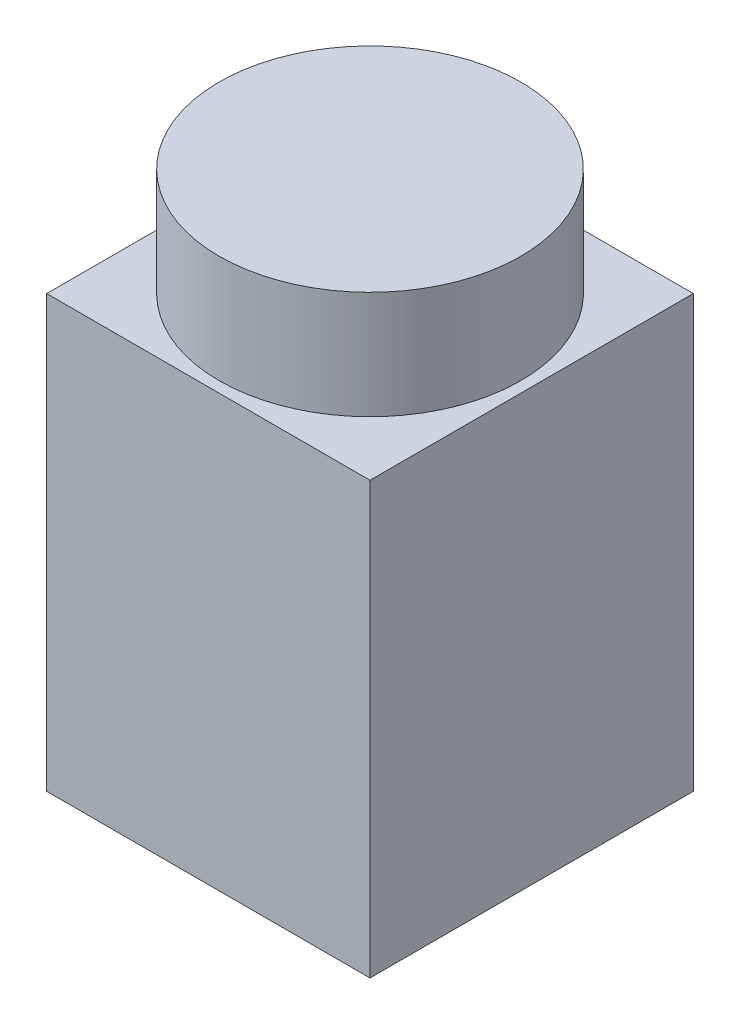
ISO-10303-21;
HEADER;
FILE_DESCRIPTION(('STEP AP214'),'2;1');
FILE_NAME('part.step','',(''),(''),'','','');
FILE_SCHEMA(('AUTOMOTIVE_DESIGN { 1 0 10303 214 1 1 1 1 }'));
ENDSEC;
DATA;
#1=APPLICATION_CONTEXT('core data for automotive mechanical design processes');
#2=APPLICATION_PROTOCOL_DEFINITION('international standard','automotive_design',2000,#1);
#3=PRODUCT_CONTEXT('',#1,'mechanical');
#4=PRODUCT('Part','Part','',(#3));
#5=PRODUCT_RELATED_PRODUCT_CATEGORY('part','',(#4));
#6=PRODUCT_DEFINITION_FORMATION('','',#4);
#7=PRODUCT_DEFINITION_CONTEXT('part definition',#1,'design');
#8=PRODUCT_DEFINITION('design','',#6,#7);
#9=PRODUCT_DEFINITION_SHAPE('','',#8);
#10=(LENGTH_UNIT() NAMED_UNIT(*) SI_UNIT(.MILLI.,.METRE.));
#11=(NAMED_UNIT(*) PLANE_ANGLE_UNIT() SI_UNIT($,.RADIAN.));
#12=(NAMED_UNIT(*) SI_UNIT($,.STERADIAN.) SOLID_ANGLE_UNIT());
#13=UNCERTAINTY_MEASURE_WITH_UNIT(LENGTH_MEASURE(1.E-05),#10,'distance_accuracy_value','');
#14=(GEOMETRIC_REPRESENTATION_CONTEXT(3) GLOBAL_UNCERTAINTY_ASSIGNED_CONTEXT((#13)) GLOBAL_UNIT_ASSIGNED_CONTEXT((#10,
#11,#12)) REPRESENTATION_CONTEXT('',''));
#15=CARTESIAN_POINT('',(0.,0.,0.));
#16=DIRECTION('',(0.,0.,1.));
#17=DIRECTION('',(1.,0.,0.));
#18=AXIS2_PLACEMENT_3D('',#15,#16,#17);
#19=CARTESIAN_POINT('',(0.,40.,0.));
#20=DIRECTION('',(1.,0.,0.));
#21=DIRECTION('',(0.,0.,-1.));
#22=AXIS2_PLACEMENT_3D('',#19,#20,#21);
#23=PLANE('',#22);
#24=DIRECTION('',(0.,0.,1.));
#25=VECTOR('',#24,1.);
#26=CARTESIAN_POINT('',(0.,0.,0.));
#27=LINE('',#26,#25);
#28=CARTESIAN_POINT('',(0.,0.,-30.));
#29=VERTEX_POINT('',#28);
#30=CARTESIAN_POINT('',(0.,0.,0.));
#31=VERTEX_POINT('',#30);
#32=EDGE_CURVE('E102',#29,#31,#27,.T.);
#33=ORIENTED_EDGE('',*,*,#32,.T.);
#34=DIRECTION('',(0.,-1.,0.));
#35=VECTOR('',#34,1.);
#36=CARTESIAN_POINT('',(0.,40.,0.));
#37=LINE('',#36,#35);
#38=CARTESIAN_POINT('',(0.,40.,0.));
#39=VERTEX_POINT('',#38);
#40=EDGE_CURVE('E39',#39,#31,#37,.T.);
#41=ORIENTED_EDGE('',*,*,#40,.F.);
#42=DIRECTION('',(0.,0.,1.));
#43=VECTOR('',#42,1.);
#44=CARTESIAN_POINT('',(0.,40.,0.));
#45=LINE('',#44,#43);
#46=CARTESIAN_POINT('',(0.,40.,-30.));
#47=VERTEX_POINT('',#46);
#48=EDGE_CURVE('E89',#47,#39,#45,.T.);
#49=ORIENTED_EDGE('',*,*,#48,.F.);
#50=DIRECTION('',(0.,-1.,0.));
#51=VECTOR('',#50,1.);
#52=CARTESIAN_POINT('',(0.,40.,-30.));
#53=LINE('',#52,#51);
#54=EDGE_CURVE('E98',#47,#29,#53,.T.);
#55=ORIENTED_EDGE('',*,*,#54,.T.);
#56=EDGE_LOOP('',(#33,#41,#49,#55));
#57=FACE_BOUND('',#56,.T.);
#58=ADVANCED_FACE('F36',(#57),#23,.F.);
#59=CARTESIAN_POINT('',(0.,40.,0.));
#60=DIRECTION('',(0.,0.,-1.));
#61=DIRECTION('',(-1.,0.,0.));
#62=AXIS2_PLACEMENT_3D('',#59,#60,#61);
#63=PLANE('',#62);
#64=DIRECTION('',(1.,0.,0.));
#65=VECTOR('',#64,1.);
#66=CARTESIAN_POINT('',(0.,0.,0.));
#67=LINE('',#66,#65);
#68=CARTESIAN_POINT('',(30.,0.,0.));
#69=VERTEX_POINT('',#68);
#70=EDGE_CURVE('E94',#31,#69,#67,.T.);
#71=ORIENTED_EDGE('',*,*,#70,.T.);
#72=DIRECTION('',(0.,-1.,0.));
#73=VECTOR('',#72,1.);
#74=CARTESIAN_POINT('',(30.,40.,0.));
#75=LINE('',#74,#73);
#76=CARTESIAN_POINT('',(30.,40.,0.));
#77=VERTEX_POINT('',#76);
#78=EDGE_CURVE('E92',#77,#69,#75,.T.);
#79=ORIENTED_EDGE('',*,*,#78,.F.);
#80=DIRECTION('',(1.,0.,0.));
#81=VECTOR('',#80,1.);
#82=CARTESIAN_POINT('',(0.,40.,0.));
#83=LINE('',#82,#81);
#84=EDGE_CURVE('E84',#39,#77,#83,.T.);
#85=ORIENTED_EDGE('',*,*,#84,.F.);
#86=ORIENTED_EDGE('',*,*,#40,.T.);
#87=EDGE_LOOP('',(#71,#79,#85,#86));
#88=FACE_BOUND('',#87,.T.);
#89=ADVANCED_FACE('F93',(#88),#63,.F.);
#90=CARTESIAN_POINT('',(30.,40.,0.));
#91=DIRECTION('',(-1.,0.,0.));
#92=DIRECTION('',(0.,0.,1.));
#93=AXIS2_PLACEMENT_3D('',#90,#91,#92);
#94=PLANE('',#93);
#95=DIRECTION('',(0.,0.,-1.));
#96=VECTOR('',#95,1.);
#97=CARTESIAN_POINT('',(30.,0.,0.));
#98=LINE('',#97,#96);
#99=CARTESIAN_POINT('',(30.,0.,-30.));
#100=VERTEX_POINT('',#99);
#101=EDGE_CURVE('E70',#69,#100,#98,.T.);
#102=ORIENTED_EDGE('',*,*,#101,.T.);
#103=DIRECTION('',(0.,-1.,0.));
#104=VECTOR('',#103,1.);
#105=CARTESIAN_POINT('',(30.,40.,-30.));
#106=LINE('',#105,#104);
#107=CARTESIAN_POINT('',(30.,40.,-30.));
#108=VERTEX_POINT('',#107);
#109=EDGE_CURVE('E95',#108,#100,#106,.T.);
#110=ORIENTED_EDGE('',*,*,#109,.F.);
#111=DIRECTION('',(0.,0.,-1.));
#112=VECTOR('',#111,1.);
#113=CARTESIAN_POINT('',(30.,40.,0.));
#114=LINE('',#113,#112);
#115=EDGE_CURVE('E87',#77,#108,#114,.T.);
#116=ORIENTED_EDGE('',*,*,#115,.F.);
#117=ORIENTED_EDGE('',*,*,#78,.T.);
#118=EDGE_LOOP('',(#102,#110,#116,#117));
#119=FACE_BOUND('',#118,.T.);
#120=ADVANCED_FACE('F96',(#119),#94,.F.);
#121=CARTESIAN_POINT('',(0.,40.,-30.));
#122=DIRECTION('',(0.,0.,1.));
#123=DIRECTION('',(1.,0.,0.));
#124=AXIS2_PLACEMENT_3D('',#121,#122,#123);
#125=PLANE('',#124);
#126=DIRECTION('',(-1.,0.,0.));
#127=VECTOR('',#126,1.);
#128=CARTESIAN_POINT('',(0.,0.,-30.));
#129=LINE('',#128,#127);
#130=EDGE_CURVE('E76',#100,#29,#129,.T.);
#131=ORIENTED_EDGE('',*,*,#130,.T.);
#132=ORIENTED_EDGE('',*,*,#54,.F.);
#133=DIRECTION('',(-1.,0.,0.));
#134=VECTOR('',#133,1.);
#135=CARTESIAN_POINT('',(0.,40.,-30.));
#136=LINE('',#135,#134);
#137=EDGE_CURVE('E53',#108,#47,#136,.T.);
#138=ORIENTED_EDGE('',*,*,#137,.F.);
#139=ORIENTED_EDGE('',*,*,#109,.T.);
#140=EDGE_LOOP('',(#131,#132,#138,#139));
#141=FACE_BOUND('',#140,.T.);
#142=ADVANCED_FACE('F110',(#141),#125,.F.);
#143=CARTESIAN_POINT('',(0.,40.,0.));
#144=DIRECTION('',(0.,-1.,0.));
#145=DIRECTION('',(0.,0.,-1.));
#146=AXIS2_PLACEMENT_3D('',#143,#144,#145);
#147=PLANE('',#146);
#148=CARTESIAN_POINT('',(15.,40.,-15.));
#149=DIRECTION('',(0.,1.,0.));
#150=DIRECTION('',(0.,0.,1.));
#151=AXIS2_PLACEMENT_3D('',#148,#149,#150);
#152=CIRCLE('',#151,14.);
#153=CARTESIAN_POINT('',(15.,40.,-1.00000000000001));
#154=VERTEX_POINT('',#153);
#155=EDGE_CURVE('E11',#154,#154,#152,.T.);
#156=ORIENTED_EDGE('',*,*,#155,.F.);
#157=EDGE_LOOP('',(#156));
#158=FACE_BOUND('',#157,.T.);
#159=ORIENTED_EDGE('',*,*,#48,.T.);
#160=ORIENTED_EDGE('',*,*,#84,.T.);
#161=ORIENTED_EDGE('',*,*,#115,.T.);
#162=ORIENTED_EDGE('',*,*,#137,.T.);
#163=EDGE_LOOP('',(#159,#160,#161,#162));
#164=FACE_BOUND('',#163,.T.);
#165=ADVANCED_FACE('F85',(#158,#164),#147,.F.);
#166=CARTESIAN_POINT('',(0.,0.,0.));
#167=DIRECTION('',(0.,-1.,0.));
#168=DIRECTION('',(0.,0.,-1.));
#169=AXIS2_PLACEMENT_3D('',#166,#167,#168);
#170=PLANE('',#169);
#171=ORIENTED_EDGE('',*,*,#32,.F.);
#172=ORIENTED_EDGE('',*,*,#130,.F.);
#173=ORIENTED_EDGE('',*,*,#101,.F.);
#174=ORIENTED_EDGE('',*,*,#70,.F.);
#175=EDGE_LOOP('',(#171,#172,#173,#174));
#176=FACE_BOUND('',#175,.T.);
#177=ADVANCED_FACE('F113',(#176),#170,.T.);
#178=CARTESIAN_POINT('',(15.,50.,-15.));
#179=DIRECTION('',(0.,-1.,0.));
#180=DIRECTION('',(0.,0.,-1.));
#181=AXIS2_PLACEMENT_3D('',#178,#179,#180);
#182=CYLINDRICAL_SURFACE('',#181,14.);
#183=CARTESIAN_POINT('',(15.,50.,-15.));
#184=DIRECTION('',(0.,1.,0.));
#185=DIRECTION('',(0.,0.,1.));
#186=AXIS2_PLACEMENT_3D('',#183,#184,#185);
#187=CIRCLE('',#186,14.);
#188=CARTESIAN_POINT('',(15.,50.,-1.00000000000001));
#189=VERTEX_POINT('',#188);
#190=EDGE_CURVE('E105',#189,#189,#187,.T.);
#191=ORIENTED_EDGE('',*,*,#190,.F.);
#192=EDGE_LOOP('',(#191));
#193=FACE_BOUND('',#192,.T.);
#194=ORIENTED_EDGE('',*,*,#155,.T.);
#195=EDGE_LOOP('',(#194));
#196=FACE_BOUND('',#195,.T.);
#197=ADVANCED_FACE('F121',(#193,#196),#182,.T.);
#198=CARTESIAN_POINT('',(15.,50.,-15.));
#199=DIRECTION('',(0.,1.,0.));
#200=DIRECTION('',(0.,0.,1.));
#201=AXIS2_PLACEMENT_3D('',#198,#199,#200);
#202=PLANE('',#201);
#203=ORIENTED_EDGE('',*,*,#190,.T.);
#204=EDGE_LOOP('',(#203));
#205=FACE_BOUND('',#204,.T.);
#206=ADVANCED_FACE('F119',(#205),#202,.T.);
#207=CLOSED_SHELL('',(#58,#89,#120,#142,#165,#177,#197,#206));
#208=MANIFOLD_SOLID_BREP('B2',#207);
#209=ADVANCED_BREP_SHAPE_REPRESENTATION('',(#18,#208),#14);
#210=SHAPE_DEFINITION_REPRESENTATION(#9,#209);
ENDSEC;
END-ISO-10303-21;
